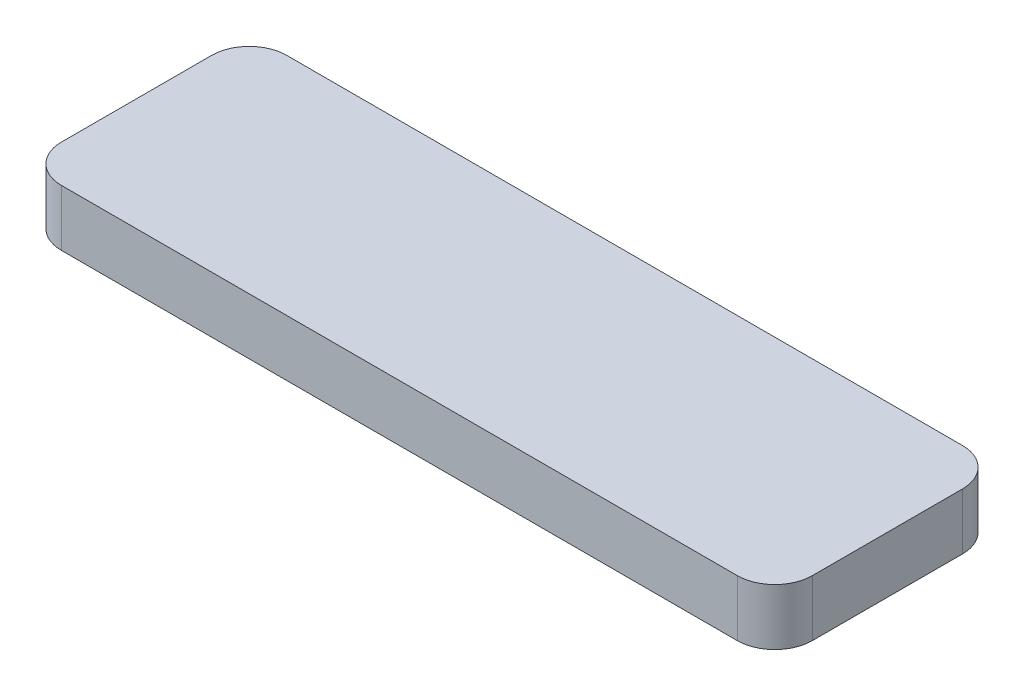
ISO-10303-21;
HEADER;
FILE_DESCRIPTION(('STEP AP214'),'2;1');
FILE_NAME('part.step','',(''),(''),'','','');
FILE_SCHEMA(('AUTOMOTIVE_DESIGN { 1 0 10303 214 1 1 1 1 }'));
ENDSEC;
DATA;
#1=APPLICATION_CONTEXT('core data for automotive mechanical design processes');
#2=APPLICATION_PROTOCOL_DEFINITION('international standard','automotive_design',2000,#1);
#3=PRODUCT_CONTEXT('',#1,'mechanical');
#4=PRODUCT('Part','Part','',(#3));
#5=PRODUCT_RELATED_PRODUCT_CATEGORY('part','',(#4));
#6=PRODUCT_DEFINITION_FORMATION('','',#4);
#7=PRODUCT_DEFINITION_CONTEXT('part definition',#1,'design');
#8=PRODUCT_DEFINITION('design','',#6,#7);
#9=PRODUCT_DEFINITION_SHAPE('','',#8);
#10=(LENGTH_UNIT() NAMED_UNIT(*) SI_UNIT(.MILLI.,.METRE.));
#11=(NAMED_UNIT(*) PLANE_ANGLE_UNIT() SI_UNIT($,.RADIAN.));
#12=(NAMED_UNIT(*) SI_UNIT($,.STERADIAN.) SOLID_ANGLE_UNIT());
#13=UNCERTAINTY_MEASURE_WITH_UNIT(LENGTH_MEASURE(1.E-05),#10,'distance_accuracy_value','');
#14=(GEOMETRIC_REPRESENTATION_CONTEXT(3) GLOBAL_UNCERTAINTY_ASSIGNED_CONTEXT((#13)) GLOBAL_UNIT_ASSIGNED_CONTEXT((#10,
#11,#12)) REPRESENTATION_CONTEXT('',''));
#15=CARTESIAN_POINT('',(0.,0.,0.));
#16=DIRECTION('',(0.,0.,1.));
#17=DIRECTION('',(1.,0.,0.));
#18=AXIS2_PLACEMENT_3D('',#15,#16,#17);
#19=CARTESIAN_POINT('',(14.3766929454074,3.,6.6914235705951));
#20=DIRECTION('',(0.,-1.,0.));
#21=DIRECTION('',(0.,0.,-1.));
#22=AXIS2_PLACEMENT_3D('',#19,#20,#21);
#23=CYLINDRICAL_SURFACE('',#22,2.);
#24=CARTESIAN_POINT('',(14.3766929454074,0.,6.6914235705951));
#25=DIRECTION('',(0.,1.,0.));
#26=DIRECTION('',(0.,0.,-1.));
#27=AXIS2_PLACEMENT_3D('',#24,#25,#26);
#28=CIRCLE('',#27,2.);
#29=CARTESIAN_POINT('',(14.3766929454073,0.,8.6914235705951));
#30=VERTEX_POINT('',#29);
#31=CARTESIAN_POINT('',(16.3766929454074,0.,6.69142357059509));
#32=VERTEX_POINT('',#31);
#33=EDGE_CURVE('E146',#30,#32,#28,.T.);
#34=ORIENTED_EDGE('',*,*,#33,.T.);
#35=DIRECTION('',(0.,-1.,0.));
#36=VECTOR('',#35,1.);
#37=CARTESIAN_POINT('',(16.3766929454074,3.,6.69142357059509));
#38=LINE('',#37,#36);
#39=CARTESIAN_POINT('',(16.3766929454074,3.,6.69142357059509));
#40=VERTEX_POINT('',#39);
#41=EDGE_CURVE('E11',#40,#32,#38,.T.);
#42=ORIENTED_EDGE('',*,*,#41,.F.);
#43=CARTESIAN_POINT('',(14.3766929454074,3.,6.6914235705951));
#44=DIRECTION('',(0.,1.,0.));
#45=DIRECTION('',(0.,0.,-1.));
#46=AXIS2_PLACEMENT_3D('',#43,#44,#45);
#47=CIRCLE('',#46,2.);
#48=CARTESIAN_POINT('',(14.3766929454073,3.,8.6914235705951));
#49=VERTEX_POINT('',#48);
#50=EDGE_CURVE('E168',#49,#40,#47,.T.);
#51=ORIENTED_EDGE('',*,*,#50,.F.);
#52=DIRECTION('',(0.,-1.,0.));
#53=VECTOR('',#52,1.);
#54=CARTESIAN_POINT('',(14.3766929454073,3.,8.6914235705951));
#55=LINE('',#54,#53);
#56=EDGE_CURVE('E142',#49,#30,#55,.T.);
#57=ORIENTED_EDGE('',*,*,#56,.T.);
#58=EDGE_LOOP('',(#34,#42,#51,#57));
#59=FACE_BOUND('',#58,.T.);
#60=ADVANCED_FACE('F45',(#59),#23,.T.);
#61=CARTESIAN_POINT('',(16.3766929454074,3.,-1.30857642940488));
#62=DIRECTION('',(-1.,0.,0.));
#63=DIRECTION('',(0.,0.,1.));
#64=AXIS2_PLACEMENT_3D('',#61,#62,#63);
#65=PLANE('',#64);
#66=DIRECTION('',(0.,0.,-1.));
#67=VECTOR('',#66,1.);
#68=CARTESIAN_POINT('',(16.3766929454074,0.,-1.30857642940488));
#69=LINE('',#68,#67);
#70=CARTESIAN_POINT('',(16.3766929454074,0.,-1.30857642940488));
#71=VERTEX_POINT('',#70);
#72=EDGE_CURVE('E150',#32,#71,#69,.T.);
#73=ORIENTED_EDGE('',*,*,#72,.T.);
#74=DIRECTION('',(0.,-1.,0.));
#75=VECTOR('',#74,1.);
#76=CARTESIAN_POINT('',(16.3766929454074,3.,-1.30857642940488));
#77=LINE('',#76,#75);
#78=CARTESIAN_POINT('',(16.3766929454074,3.,-1.30857642940488));
#79=VERTEX_POINT('',#78);
#80=EDGE_CURVE('E54',#79,#71,#77,.T.);
#81=ORIENTED_EDGE('',*,*,#80,.F.);
#82=DIRECTION('',(0.,0.,-1.));
#83=VECTOR('',#82,1.);
#84=CARTESIAN_POINT('',(16.3766929454074,3.,-1.30857642940488));
#85=LINE('',#84,#83);
#86=EDGE_CURVE('E105',#40,#79,#85,.T.);
#87=ORIENTED_EDGE('',*,*,#86,.F.);
#88=ORIENTED_EDGE('',*,*,#41,.T.);
#89=EDGE_LOOP('',(#73,#81,#87,#88));
#90=FACE_BOUND('',#89,.T.);
#91=ADVANCED_FACE('F214',(#90),#65,.F.);
#92=CARTESIAN_POINT('',(14.3766929454074,3.,-1.3085764294049));
#93=DIRECTION('',(0.,-1.,0.));
#94=DIRECTION('',(0.,0.,-1.));
#95=AXIS2_PLACEMENT_3D('',#92,#93,#94);
#96=CYLINDRICAL_SURFACE('',#95,2.);
#97=CARTESIAN_POINT('',(14.3766929454074,0.,-1.3085764294049));
#98=DIRECTION('',(0.,1.,0.));
#99=DIRECTION('',(0.,0.,1.));
#100=AXIS2_PLACEMENT_3D('',#97,#98,#99);
#101=CIRCLE('',#100,2.);
#102=CARTESIAN_POINT('',(14.3766929454073,0.,-3.3085764294049));
#103=VERTEX_POINT('',#102);
#104=EDGE_CURVE('E153',#71,#103,#101,.T.);
#105=ORIENTED_EDGE('',*,*,#104,.T.);
#106=DIRECTION('',(0.,-1.,0.));
#107=VECTOR('',#106,1.);
#108=CARTESIAN_POINT('',(14.3766929454073,3.,-3.3085764294049));
#109=LINE('',#108,#107);
#110=CARTESIAN_POINT('',(14.3766929454073,3.,-3.3085764294049));
#111=VERTEX_POINT('',#110);
#112=EDGE_CURVE('E179',#111,#103,#109,.T.);
#113=ORIENTED_EDGE('',*,*,#112,.F.);
#114=CARTESIAN_POINT('',(14.3766929454074,3.,-1.3085764294049));
#115=DIRECTION('',(0.,1.,0.));
#116=DIRECTION('',(0.,0.,1.));
#117=AXIS2_PLACEMENT_3D('',#114,#115,#116);
#118=CIRCLE('',#117,2.);
#119=EDGE_CURVE('E189',#79,#111,#118,.T.);
#120=ORIENTED_EDGE('',*,*,#119,.F.);
#121=ORIENTED_EDGE('',*,*,#80,.T.);
#122=EDGE_LOOP('',(#105,#113,#120,#121));
#123=FACE_BOUND('',#122,.T.);
#124=ADVANCED_FACE('F187',(#123),#96,.T.);
#125=CARTESIAN_POINT('',(-21.6233070545926,3.,-3.3085764294049));
#126=DIRECTION('',(0.,0.,1.));
#127=DIRECTION('',(1.,0.,0.));
#128=AXIS2_PLACEMENT_3D('',#125,#126,#127);
#129=PLANE('',#128);
#130=DIRECTION('',(-1.,0.,0.));
#131=VECTOR('',#130,1.);
#132=CARTESIAN_POINT('',(-21.6233070545926,0.,-3.3085764294049));
#133=LINE('',#132,#131);
#134=CARTESIAN_POINT('',(-21.6233070545926,0.,-3.3085764294049));
#135=VERTEX_POINT('',#134);
#136=EDGE_CURVE('E156',#103,#135,#133,.T.);
#137=ORIENTED_EDGE('',*,*,#136,.T.);
#138=DIRECTION('',(0.,-1.,0.));
#139=VECTOR('',#138,1.);
#140=CARTESIAN_POINT('',(-21.6233070545926,3.,-3.3085764294049));
#141=LINE('',#140,#139);
#142=CARTESIAN_POINT('',(-21.6233070545926,3.,-3.3085764294049));
#143=VERTEX_POINT('',#142);
#144=EDGE_CURVE('E175',#143,#135,#141,.T.);
#145=ORIENTED_EDGE('',*,*,#144,.F.);
#146=DIRECTION('',(-1.,0.,0.));
#147=VECTOR('',#146,1.);
#148=CARTESIAN_POINT('',(-21.6233070545926,3.,-3.3085764294049));
#149=LINE('',#148,#147);
#150=EDGE_CURVE('E202',#111,#143,#149,.T.);
#151=ORIENTED_EDGE('',*,*,#150,.F.);
#152=ORIENTED_EDGE('',*,*,#112,.T.);
#153=EDGE_LOOP('',(#137,#145,#151,#152));
#154=FACE_BOUND('',#153,.T.);
#155=ADVANCED_FACE('F197',(#154),#129,.F.);
#156=CARTESIAN_POINT('',(-21.6233070545926,3.,-1.3085764294049));
#157=DIRECTION('',(0.,-1.,0.));
#158=DIRECTION('',(0.,0.,-1.));
#159=AXIS2_PLACEMENT_3D('',#156,#157,#158);
#160=CYLINDRICAL_SURFACE('',#159,2.);
#161=CARTESIAN_POINT('',(-21.6233070545926,0.,-1.3085764294049));
#162=DIRECTION('',(0.,1.,0.));
#163=DIRECTION('',(0.,0.,-1.));
#164=AXIS2_PLACEMENT_3D('',#161,#162,#163);
#165=CIRCLE('',#164,2.);
#166=CARTESIAN_POINT('',(-23.6233070545926,0.,-1.30857642940488));
#167=VERTEX_POINT('',#166);
#168=EDGE_CURVE('E159',#135,#167,#165,.T.);
#169=ORIENTED_EDGE('',*,*,#168,.T.);
#170=DIRECTION('',(0.,-1.,0.));
#171=VECTOR('',#170,1.);
#172=CARTESIAN_POINT('',(-23.6233070545926,3.,-1.30857642940488));
#173=LINE('',#172,#171);
#174=CARTESIAN_POINT('',(-23.6233070545926,3.,-1.30857642940488));
#175=VERTEX_POINT('',#174);
#176=EDGE_CURVE('E135',#175,#167,#173,.T.);
#177=ORIENTED_EDGE('',*,*,#176,.F.);
#178=CARTESIAN_POINT('',(-21.6233070545926,3.,-1.3085764294049));
#179=DIRECTION('',(0.,1.,0.));
#180=DIRECTION('',(0.,0.,-1.));
#181=AXIS2_PLACEMENT_3D('',#178,#179,#180);
#182=CIRCLE('',#181,2.);
#183=EDGE_CURVE('E124',#143,#175,#182,.T.);
#184=ORIENTED_EDGE('',*,*,#183,.F.);
#185=ORIENTED_EDGE('',*,*,#144,.T.);
#186=EDGE_LOOP('',(#169,#177,#184,#185));
#187=FACE_BOUND('',#186,.T.);
#188=ADVANCED_FACE('F200',(#187),#160,.T.);
#189=CARTESIAN_POINT('',(-23.6233070545926,3.,-1.30857642940488));
#190=DIRECTION('',(1.,0.,0.));
#191=DIRECTION('',(0.,0.,-1.));
#192=AXIS2_PLACEMENT_3D('',#189,#190,#191);
#193=PLANE('',#192);
#194=DIRECTION('',(0.,0.,1.));
#195=VECTOR('',#194,1.);
#196=CARTESIAN_POINT('',(-23.6233070545926,0.,-1.30857642940488));
#197=LINE('',#196,#195);
#198=CARTESIAN_POINT('',(-23.6233070545926,0.,6.69142357059509));
#199=VERTEX_POINT('',#198);
#200=EDGE_CURVE('E133',#167,#199,#197,.T.);
#201=ORIENTED_EDGE('',*,*,#200,.T.);
#202=DIRECTION('',(0.,-1.,0.));
#203=VECTOR('',#202,1.);
#204=CARTESIAN_POINT('',(-23.6233070545926,3.,6.69142357059509));
#205=LINE('',#204,#203);
#206=CARTESIAN_POINT('',(-23.6233070545926,3.,6.69142357059509));
#207=VERTEX_POINT('',#206);
#208=EDGE_CURVE('E130',#207,#199,#205,.T.);
#209=ORIENTED_EDGE('',*,*,#208,.F.);
#210=DIRECTION('',(0.,0.,1.));
#211=VECTOR('',#210,1.);
#212=CARTESIAN_POINT('',(-23.6233070545926,3.,-1.30857642940488));
#213=LINE('',#212,#211);
#214=EDGE_CURVE('E118',#175,#207,#213,.T.);
#215=ORIENTED_EDGE('',*,*,#214,.F.);
#216=ORIENTED_EDGE('',*,*,#176,.T.);
#217=EDGE_LOOP('',(#201,#209,#215,#216));
#218=FACE_BOUND('',#217,.T.);
#219=ADVANCED_FACE('F131',(#218),#193,.F.);
#220=CARTESIAN_POINT('',(-21.6233070545926,3.,6.6914235705951));
#221=DIRECTION('',(0.,-1.,0.));
#222=DIRECTION('',(0.,0.,-1.));
#223=AXIS2_PLACEMENT_3D('',#220,#221,#222);
#224=CYLINDRICAL_SURFACE('',#223,2.);
#225=CARTESIAN_POINT('',(-21.6233070545926,0.,6.6914235705951));
#226=DIRECTION('',(0.,1.,0.));
#227=DIRECTION('',(0.,0.,1.));
#228=AXIS2_PLACEMENT_3D('',#225,#226,#227);
#229=CIRCLE('',#228,2.);
#230=CARTESIAN_POINT('',(-21.6233070545926,0.,8.6914235705951));
#231=VERTEX_POINT('',#230);
#232=EDGE_CURVE('E91',#199,#231,#229,.T.);
#233=ORIENTED_EDGE('',*,*,#232,.T.);
#234=DIRECTION('',(0.,-1.,0.));
#235=VECTOR('',#234,1.);
#236=CARTESIAN_POINT('',(-21.6233070545926,3.,8.6914235705951));
#237=LINE('',#236,#235);
#238=CARTESIAN_POINT('',(-21.6233070545926,3.,8.6914235705951));
#239=VERTEX_POINT('',#238);
#240=EDGE_CURVE('E136',#239,#231,#237,.T.);
#241=ORIENTED_EDGE('',*,*,#240,.F.);
#242=CARTESIAN_POINT('',(-21.6233070545926,3.,6.6914235705951));
#243=DIRECTION('',(0.,1.,0.));
#244=DIRECTION('',(0.,0.,1.));
#245=AXIS2_PLACEMENT_3D('',#242,#243,#244);
#246=CIRCLE('',#245,2.);
#247=EDGE_CURVE('E122',#207,#239,#246,.T.);
#248=ORIENTED_EDGE('',*,*,#247,.F.);
#249=ORIENTED_EDGE('',*,*,#208,.T.);
#250=EDGE_LOOP('',(#233,#241,#248,#249));
#251=FACE_BOUND('',#250,.T.);
#252=ADVANCED_FACE('F138',(#251),#224,.T.);
#253=CARTESIAN_POINT('',(-21.6233070545926,3.,8.6914235705951));
#254=DIRECTION('',(0.,0.,-1.));
#255=DIRECTION('',(-1.,0.,0.));
#256=AXIS2_PLACEMENT_3D('',#253,#254,#255);
#257=PLANE('',#256);
#258=DIRECTION('',(1.,0.,0.));
#259=VECTOR('',#258,1.);
#260=CARTESIAN_POINT('',(-21.6233070545926,0.,8.6914235705951));
#261=LINE('',#260,#259);
#262=EDGE_CURVE('E97',#231,#30,#261,.T.);
#263=ORIENTED_EDGE('',*,*,#262,.T.);
#264=ORIENTED_EDGE('',*,*,#56,.F.);
#265=DIRECTION('',(1.,0.,0.));
#266=VECTOR('',#265,1.);
#267=CARTESIAN_POINT('',(-21.6233070545926,3.,8.6914235705951));
#268=LINE('',#267,#266);
#269=EDGE_CURVE('E62',#239,#49,#268,.T.);
#270=ORIENTED_EDGE('',*,*,#269,.F.);
#271=ORIENTED_EDGE('',*,*,#240,.T.);
#272=EDGE_LOOP('',(#263,#264,#270,#271));
#273=FACE_BOUND('',#272,.T.);
#274=ADVANCED_FACE('F230',(#273),#257,.F.);
#275=CARTESIAN_POINT('',(14.3766929454074,3.,6.6914235705951));
#276=DIRECTION('',(0.,-1.,0.));
#277=DIRECTION('',(0.,0.,-1.));
#278=AXIS2_PLACEMENT_3D('',#275,#276,#277);
#279=PLANE('',#278);
#280=ORIENTED_EDGE('',*,*,#50,.T.);
#281=ORIENTED_EDGE('',*,*,#86,.T.);
#282=ORIENTED_EDGE('',*,*,#119,.T.);
#283=ORIENTED_EDGE('',*,*,#150,.T.);
#284=ORIENTED_EDGE('',*,*,#183,.T.);
#285=ORIENTED_EDGE('',*,*,#214,.T.);
#286=ORIENTED_EDGE('',*,*,#247,.T.);
#287=ORIENTED_EDGE('',*,*,#269,.T.);
#288=EDGE_LOOP('',(#280,#281,#282,#283,#284,#285,#286,#287));
#289=FACE_BOUND('',#288,.T.);
#290=ADVANCED_FACE('F120',(#289),#279,.F.);
#291=CARTESIAN_POINT('',(14.3766929454074,0.,6.6914235705951));
#292=DIRECTION('',(0.,-1.,0.));
#293=DIRECTION('',(0.,0.,-1.));
#294=AXIS2_PLACEMENT_3D('',#291,#292,#293);
#295=PLANE('',#294);
#296=ORIENTED_EDGE('',*,*,#33,.F.);
#297=ORIENTED_EDGE('',*,*,#262,.F.);
#298=ORIENTED_EDGE('',*,*,#232,.F.);
#299=ORIENTED_EDGE('',*,*,#200,.F.);
#300=ORIENTED_EDGE('',*,*,#168,.F.);
#301=ORIENTED_EDGE('',*,*,#136,.F.);
#302=ORIENTED_EDGE('',*,*,#104,.F.);
#303=ORIENTED_EDGE('',*,*,#72,.F.);
#304=EDGE_LOOP('',(#296,#297,#298,#299,#300,#301,#302,#303));
#305=FACE_BOUND('',#304,.T.);
#306=ADVANCED_FACE('F193',(#305),#295,.T.);
#307=CLOSED_SHELL('',(#60,#91,#124,#155,#188,#219,#252,#274,#290,#306));
#308=MANIFOLD_SOLID_BREP('B2',#307);
#309=ADVANCED_BREP_SHAPE_REPRESENTATION('',(#18,#308),#14);
#310=SHAPE_DEFINITION_REPRESENTATION(#9,#309);
ENDSEC;
END-ISO-10303-21;
